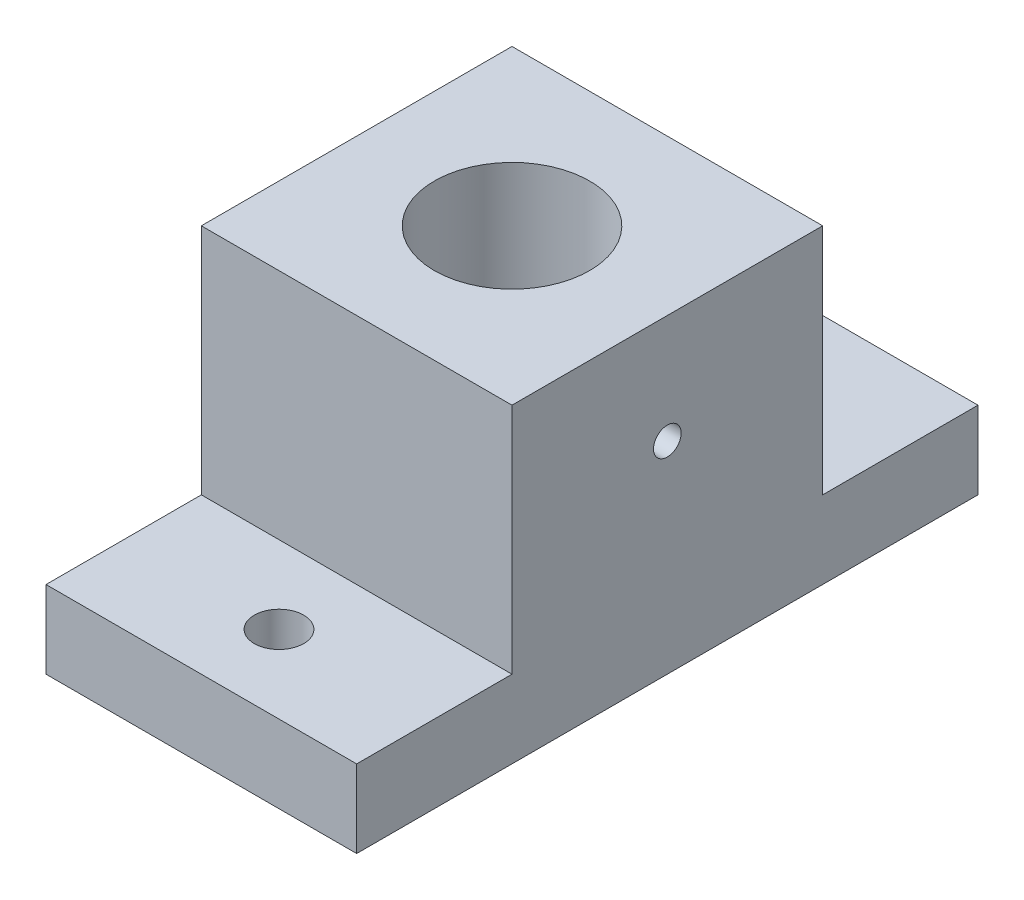
ISO-10303-21;
HEADER;
FILE_DESCRIPTION(('STEP AP214'),'2;1');
FILE_NAME('part.step','',(''),(''),'','','');
FILE_SCHEMA(('AUTOMOTIVE_DESIGN { 1 0 10303 214 1 1 1 1 }'));
ENDSEC;
DATA;
#1=APPLICATION_CONTEXT('core data for automotive mechanical design processes');
#2=APPLICATION_PROTOCOL_DEFINITION('international standard','automotive_design',2000,#1);
#3=PRODUCT_CONTEXT('',#1,'mechanical');
#4=PRODUCT('Part','Part','',(#3));
#5=PRODUCT_RELATED_PRODUCT_CATEGORY('part','',(#4));
#6=PRODUCT_DEFINITION_FORMATION('','',#4);
#7=PRODUCT_DEFINITION_CONTEXT('part definition',#1,'design');
#8=PRODUCT_DEFINITION('design','',#6,#7);
#9=PRODUCT_DEFINITION_SHAPE('','',#8);
#10=(LENGTH_UNIT() NAMED_UNIT(*) SI_UNIT(.MILLI.,.METRE.));
#11=(NAMED_UNIT(*) PLANE_ANGLE_UNIT() SI_UNIT($,.RADIAN.));
#12=(NAMED_UNIT(*) SI_UNIT($,.STERADIAN.) SOLID_ANGLE_UNIT());
#13=UNCERTAINTY_MEASURE_WITH_UNIT(LENGTH_MEASURE(1.E-05),#10,'distance_accuracy_value','');
#14=(GEOMETRIC_REPRESENTATION_CONTEXT(3) GLOBAL_UNCERTAINTY_ASSIGNED_CONTEXT((#13)) GLOBAL_UNIT_ASSIGNED_CONTEXT((#10,
#11,#12)) REPRESENTATION_CONTEXT('',''));
#15=CARTESIAN_POINT('',(0.,0.,0.));
#16=DIRECTION('',(0.,0.,1.));
#17=DIRECTION('',(1.,0.,0.));
#18=AXIS2_PLACEMENT_3D('',#15,#16,#17);
#19=CARTESIAN_POINT('',(0.,6.35,0.));
#20=DIRECTION('',(0.,1.,0.));
#21=DIRECTION('',(0.,0.,1.));
#22=AXIS2_PLACEMENT_3D('',#19,#20,#21);
#23=PLANE('',#22);
#24=CARTESIAN_POINT('',(0.,6.35,-19.05));
#25=DIRECTION('',(0.,1.,0.));
#26=DIRECTION('',(0.,0.,1.));
#27=AXIS2_PLACEMENT_3D('',#24,#25,#26);
#28=CIRCLE('',#27,2.01929999999999);
#29=CARTESIAN_POINT('',(0.,6.35,-17.0307));
#30=VERTEX_POINT('',#29);
#31=EDGE_CURVE('E193',#30,#30,#28,.T.);
#32=ORIENTED_EDGE('',*,*,#31,.F.);
#33=EDGE_LOOP('',(#32));
#34=FACE_BOUND('',#33,.T.);
#35=DIRECTION('',(-1.,0.,0.));
#36=VECTOR('',#35,1.);
#37=CARTESIAN_POINT('',(12.7,6.35,-12.7));
#38=LINE('',#37,#36);
#39=CARTESIAN_POINT('',(12.7,6.35,-12.7));
#40=VERTEX_POINT('',#39);
#41=CARTESIAN_POINT('',(-12.7,6.35,-12.7));
#42=VERTEX_POINT('',#41);
#43=EDGE_CURVE('E49',#40,#42,#38,.T.);
#44=ORIENTED_EDGE('',*,*,#43,.F.);
#45=DIRECTION('',(0.,0.,-1.));
#46=VECTOR('',#45,1.);
#47=CARTESIAN_POINT('',(12.7,6.35,25.4));
#48=LINE('',#47,#46);
#49=CARTESIAN_POINT('',(12.7,6.35,-25.4));
#50=VERTEX_POINT('',#49);
#51=EDGE_CURVE('E134',#40,#50,#48,.T.);
#52=ORIENTED_EDGE('',*,*,#51,.T.);
#53=DIRECTION('',(-1.,0.,0.));
#54=VECTOR('',#53,1.);
#55=CARTESIAN_POINT('',(12.7,6.35,-25.4));
#56=LINE('',#55,#54);
#57=CARTESIAN_POINT('',(-12.7,6.35,-25.4));
#58=VERTEX_POINT('',#57);
#59=EDGE_CURVE('E137',#50,#58,#56,.T.);
#60=ORIENTED_EDGE('',*,*,#59,.T.);
#61=DIRECTION('',(0.,0.,1.));
#62=VECTOR('',#61,1.);
#63=CARTESIAN_POINT('',(-12.7,6.35,25.4));
#64=LINE('',#63,#62);
#65=EDGE_CURVE('E130',#58,#42,#64,.T.);
#66=ORIENTED_EDGE('',*,*,#65,.T.);
#67=EDGE_LOOP('',(#44,#52,#60,#66));
#68=FACE_BOUND('',#67,.T.);
#69=ADVANCED_FACE('F34',(#34,#68),#23,.T.);
#70=CARTESIAN_POINT('',(-12.7,6.35,25.4));
#71=DIRECTION('',(1.,0.,0.));
#72=DIRECTION('',(0.,0.,-1.));
#73=AXIS2_PLACEMENT_3D('',#70,#71,#72);
#74=PLANE('',#73);
#75=DIRECTION('',(0.,0.,1.));
#76=VECTOR('',#75,1.);
#77=CARTESIAN_POINT('',(-12.7,0.,25.4));
#78=LINE('',#77,#76);
#79=CARTESIAN_POINT('',(-12.7,0.,-25.4));
#80=VERTEX_POINT('',#79);
#81=CARTESIAN_POINT('',(-12.7,0.,25.4));
#82=VERTEX_POINT('',#81);
#83=EDGE_CURVE('E122',#80,#82,#78,.T.);
#84=ORIENTED_EDGE('',*,*,#83,.T.);
#85=DIRECTION('',(0.,-1.,0.));
#86=VECTOR('',#85,1.);
#87=CARTESIAN_POINT('',(-12.7,6.35,25.4));
#88=LINE('',#87,#86);
#89=CARTESIAN_POINT('',(-12.7,6.35,25.4));
#90=VERTEX_POINT('',#89);
#91=EDGE_CURVE('E11',#90,#82,#88,.T.);
#92=ORIENTED_EDGE('',*,*,#91,.F.);
#93=CARTESIAN_POINT('',(-12.7,6.35,12.7));
#94=VERTEX_POINT('',#93);
#95=EDGE_CURVE('E121',#94,#90,#64,.T.);
#96=ORIENTED_EDGE('',*,*,#95,.F.);
#97=DIRECTION('',(0.,-1.,0.));
#98=VECTOR('',#97,1.);
#99=CARTESIAN_POINT('',(-12.7,25.4,12.7));
#100=LINE('',#99,#98);
#101=CARTESIAN_POINT('',(-12.7,25.4,12.7));
#102=VERTEX_POINT('',#101);
#103=EDGE_CURVE('E103',#102,#94,#100,.T.);
#104=ORIENTED_EDGE('',*,*,#103,.F.);
#105=DIRECTION('',(0.,0.,1.));
#106=VECTOR('',#105,1.);
#107=CARTESIAN_POINT('',(-12.7,25.4,12.7));
#108=LINE('',#107,#106);
#109=CARTESIAN_POINT('',(-12.7,25.4,-12.7));
#110=VERTEX_POINT('',#109);
#111=EDGE_CURVE('E109',#110,#102,#108,.T.);
#112=ORIENTED_EDGE('',*,*,#111,.F.);
#113=DIRECTION('',(0.,-1.,0.));
#114=VECTOR('',#113,1.);
#115=CARTESIAN_POINT('',(-12.7,25.4,-12.7));
#116=LINE('',#115,#114);
#117=EDGE_CURVE('E167',#110,#42,#116,.T.);
#118=ORIENTED_EDGE('',*,*,#117,.T.);
#119=ORIENTED_EDGE('',*,*,#65,.F.);
#120=DIRECTION('',(0.,-1.,0.));
#121=VECTOR('',#120,1.);
#122=CARTESIAN_POINT('',(-12.7,6.35,-25.4));
#123=LINE('',#122,#121);
#124=EDGE_CURVE('E138',#58,#80,#123,.T.);
#125=ORIENTED_EDGE('',*,*,#124,.T.);
#126=EDGE_LOOP('',(#84,#92,#96,#104,#112,#118,#119,#125));
#127=FACE_BOUND('',#126,.T.);
#128=ADVANCED_FACE('F36',(#127),#74,.F.);
#129=CARTESIAN_POINT('',(12.7,6.35,25.4));
#130=DIRECTION('',(0.,0.,-1.));
#131=DIRECTION('',(-1.,0.,0.));
#132=AXIS2_PLACEMENT_3D('',#129,#130,#131);
#133=PLANE('',#132);
#134=DIRECTION('',(1.,0.,0.));
#135=VECTOR('',#134,1.);
#136=CARTESIAN_POINT('',(12.7,0.,25.4));
#137=LINE('',#136,#135);
#138=CARTESIAN_POINT('',(12.7,0.,25.4));
#139=VERTEX_POINT('',#138);
#140=EDGE_CURVE('E124',#82,#139,#137,.T.);
#141=ORIENTED_EDGE('',*,*,#140,.T.);
#142=DIRECTION('',(0.,-1.,0.));
#143=VECTOR('',#142,1.);
#144=CARTESIAN_POINT('',(12.7,6.35,25.4));
#145=LINE('',#144,#143);
#146=CARTESIAN_POINT('',(12.7,6.35,25.4));
#147=VERTEX_POINT('',#146);
#148=EDGE_CURVE('E42',#147,#139,#145,.T.);
#149=ORIENTED_EDGE('',*,*,#148,.F.);
#150=DIRECTION('',(1.,0.,0.));
#151=VECTOR('',#150,1.);
#152=CARTESIAN_POINT('',(12.7,6.35,25.4));
#153=LINE('',#152,#151);
#154=EDGE_CURVE('E132',#90,#147,#153,.T.);
#155=ORIENTED_EDGE('',*,*,#154,.F.);
#156=ORIENTED_EDGE('',*,*,#91,.T.);
#157=EDGE_LOOP('',(#141,#149,#155,#156));
#158=FACE_BOUND('',#157,.T.);
#159=ADVANCED_FACE('F226',(#158),#133,.F.);
#160=CARTESIAN_POINT('',(12.7,6.35,25.4));
#161=DIRECTION('',(-1.,0.,0.));
#162=DIRECTION('',(0.,0.,1.));
#163=AXIS2_PLACEMENT_3D('',#160,#161,#162);
#164=PLANE('',#163);
#165=CARTESIAN_POINT('',(12.7,16.51,0.));
#166=DIRECTION('',(1.,0.,0.));
#167=DIRECTION('',(0.,0.,-1.));
#168=AXIS2_PLACEMENT_3D('',#165,#166,#167);
#169=CIRCLE('',#168,1.1303);
#170=CARTESIAN_POINT('',(12.7,16.51,-1.1303));
#171=VERTEX_POINT('',#170);
#172=EDGE_CURVE('E204',#171,#171,#169,.T.);
#173=ORIENTED_EDGE('',*,*,#172,.F.);
#174=EDGE_LOOP('',(#173));
#175=FACE_BOUND('',#174,.T.);
#176=DIRECTION('',(0.,0.,-1.));
#177=VECTOR('',#176,1.);
#178=CARTESIAN_POINT('',(12.7,0.,25.4));
#179=LINE('',#178,#177);
#180=CARTESIAN_POINT('',(12.7,0.,-25.4));
#181=VERTEX_POINT('',#180);
#182=EDGE_CURVE('E141',#139,#181,#179,.T.);
#183=ORIENTED_EDGE('',*,*,#182,.T.);
#184=DIRECTION('',(0.,-1.,0.));
#185=VECTOR('',#184,1.);
#186=CARTESIAN_POINT('',(12.7,6.35,-25.4));
#187=LINE('',#186,#185);
#188=EDGE_CURVE('E147',#50,#181,#187,.T.);
#189=ORIENTED_EDGE('',*,*,#188,.F.);
#190=ORIENTED_EDGE('',*,*,#51,.F.);
#191=DIRECTION('',(0.,-1.,0.));
#192=VECTOR('',#191,1.);
#193=CARTESIAN_POINT('',(12.7,25.4,-12.7));
#194=LINE('',#193,#192);
#195=CARTESIAN_POINT('',(12.7,25.4,-12.7));
#196=VERTEX_POINT('',#195);
#197=EDGE_CURVE('E126',#196,#40,#194,.T.);
#198=ORIENTED_EDGE('',*,*,#197,.F.);
#199=DIRECTION('',(0.,0.,-1.));
#200=VECTOR('',#199,1.);
#201=CARTESIAN_POINT('',(12.7,25.4,12.7));
#202=LINE('',#201,#200);
#203=CARTESIAN_POINT('',(12.7,25.4,12.7));
#204=VERTEX_POINT('',#203);
#205=EDGE_CURVE('E108',#204,#196,#202,.T.);
#206=ORIENTED_EDGE('',*,*,#205,.F.);
#207=DIRECTION('',(0.,-1.,0.));
#208=VECTOR('',#207,1.);
#209=CARTESIAN_POINT('',(12.7,25.4,12.7));
#210=LINE('',#209,#208);
#211=CARTESIAN_POINT('',(12.7,6.35,12.7));
#212=VERTEX_POINT('',#211);
#213=EDGE_CURVE('E105',#204,#212,#210,.T.);
#214=ORIENTED_EDGE('',*,*,#213,.T.);
#215=EDGE_CURVE('E135',#147,#212,#48,.T.);
#216=ORIENTED_EDGE('',*,*,#215,.F.);
#217=ORIENTED_EDGE('',*,*,#148,.T.);
#218=EDGE_LOOP('',(#183,#189,#190,#198,#206,#214,#216,#217));
#219=FACE_BOUND('',#218,.T.);
#220=ADVANCED_FACE('F154',(#175,#219),#164,.F.);
#221=CARTESIAN_POINT('',(12.7,6.35,-25.4));
#222=DIRECTION('',(0.,0.,1.));
#223=DIRECTION('',(1.,0.,0.));
#224=AXIS2_PLACEMENT_3D('',#221,#222,#223);
#225=PLANE('',#224);
#226=DIRECTION('',(-1.,0.,0.));
#227=VECTOR('',#226,1.);
#228=CARTESIAN_POINT('',(12.7,0.,-25.4));
#229=LINE('',#228,#227);
#230=EDGE_CURVE('E143',#181,#80,#229,.T.);
#231=ORIENTED_EDGE('',*,*,#230,.T.);
#232=ORIENTED_EDGE('',*,*,#124,.F.);
#233=ORIENTED_EDGE('',*,*,#59,.F.);
#234=ORIENTED_EDGE('',*,*,#188,.T.);
#235=EDGE_LOOP('',(#231,#232,#233,#234));
#236=FACE_BOUND('',#235,.T.);
#237=ADVANCED_FACE('F164',(#236),#225,.F.);
#238=CARTESIAN_POINT('',(0.,6.35,19.05));
#239=DIRECTION('',(0.,1.,0.));
#240=DIRECTION('',(0.,0.,1.));
#241=AXIS2_PLACEMENT_3D('',#238,#239,#240);
#242=CIRCLE('',#241,2.01929999999999);
#243=CARTESIAN_POINT('',(0.,6.35,21.0693));
#244=VERTEX_POINT('',#243);
#245=EDGE_CURVE('E187',#244,#244,#242,.T.);
#246=ORIENTED_EDGE('',*,*,#245,.F.);
#247=EDGE_LOOP('',(#246));
#248=FACE_BOUND('',#247,.T.);
#249=DIRECTION('',(1.,0.,0.));
#250=VECTOR('',#249,1.);
#251=CARTESIAN_POINT('',(12.7,6.35,12.7));
#252=LINE('',#251,#250);
#253=EDGE_CURVE('E57',#94,#212,#252,.T.);
#254=ORIENTED_EDGE('',*,*,#253,.F.);
#255=ORIENTED_EDGE('',*,*,#95,.T.);
#256=ORIENTED_EDGE('',*,*,#154,.T.);
#257=ORIENTED_EDGE('',*,*,#215,.T.);
#258=EDGE_LOOP('',(#254,#255,#256,#257));
#259=FACE_BOUND('',#258,.T.);
#260=ADVANCED_FACE('F222',(#248,#259),#23,.T.);
#261=CARTESIAN_POINT('',(0.,0.,0.));
#262=DIRECTION('',(0.,1.,0.));
#263=DIRECTION('',(0.,0.,1.));
#264=AXIS2_PLACEMENT_3D('',#261,#262,#263);
#265=PLANE('',#264);
#266=CARTESIAN_POINT('',(0.,0.,-19.05));
#267=DIRECTION('',(0.,1.,0.));
#268=DIRECTION('',(0.,0.,1.));
#269=AXIS2_PLACEMENT_3D('',#266,#267,#268);
#270=CIRCLE('',#269,2.0193);
#271=CARTESIAN_POINT('',(0.,0.,-17.0307));
#272=VERTEX_POINT('',#271);
#273=EDGE_CURVE('E190',#272,#272,#270,.T.);
#274=ORIENTED_EDGE('',*,*,#273,.T.);
#275=EDGE_LOOP('',(#274));
#276=FACE_BOUND('',#275,.T.);
#277=CARTESIAN_POINT('',(0.,0.,19.05));
#278=DIRECTION('',(0.,1.,0.));
#279=DIRECTION('',(0.,0.,1.));
#280=AXIS2_PLACEMENT_3D('',#277,#278,#279);
#281=CIRCLE('',#280,2.0193);
#282=CARTESIAN_POINT('',(0.,0.,21.0693));
#283=VERTEX_POINT('',#282);
#284=EDGE_CURVE('E182',#283,#283,#281,.T.);
#285=ORIENTED_EDGE('',*,*,#284,.T.);
#286=EDGE_LOOP('',(#285));
#287=FACE_BOUND('',#286,.T.);
#288=CARTESIAN_POINT('',(0.,0.,0.));
#289=DIRECTION('',(0.,1.,0.));
#290=DIRECTION('',(0.,0.,1.));
#291=AXIS2_PLACEMENT_3D('',#288,#289,#290);
#292=CIRCLE('',#291,6.35);
#293=CARTESIAN_POINT('',(0.,0.,6.35));
#294=VERTEX_POINT('',#293);
#295=EDGE_CURVE('E173',#294,#294,#292,.T.);
#296=ORIENTED_EDGE('',*,*,#295,.T.);
#297=EDGE_LOOP('',(#296));
#298=FACE_BOUND('',#297,.T.);
#299=ORIENTED_EDGE('',*,*,#83,.F.);
#300=ORIENTED_EDGE('',*,*,#230,.F.);
#301=ORIENTED_EDGE('',*,*,#182,.F.);
#302=ORIENTED_EDGE('',*,*,#140,.F.);
#303=EDGE_LOOP('',(#299,#300,#301,#302));
#304=FACE_BOUND('',#303,.T.);
#305=ADVANCED_FACE('F161',(#276,#287,#298,#304),#265,.F.);
#306=CARTESIAN_POINT('',(12.7,25.4,12.7));
#307=DIRECTION('',(0.,0.,-1.));
#308=DIRECTION('',(-1.,0.,0.));
#309=AXIS2_PLACEMENT_3D('',#306,#307,#308);
#310=PLANE('',#309);
#311=ORIENTED_EDGE('',*,*,#253,.T.);
#312=ORIENTED_EDGE('',*,*,#213,.F.);
#313=DIRECTION('',(1.,0.,0.));
#314=VECTOR('',#313,1.);
#315=CARTESIAN_POINT('',(12.7,25.4,12.7));
#316=LINE('',#315,#314);
#317=EDGE_CURVE('E99',#102,#204,#316,.T.);
#318=ORIENTED_EDGE('',*,*,#317,.F.);
#319=ORIENTED_EDGE('',*,*,#103,.T.);
#320=EDGE_LOOP('',(#311,#312,#318,#319));
#321=FACE_BOUND('',#320,.T.);
#322=ADVANCED_FACE('F101',(#321),#310,.F.);
#323=CARTESIAN_POINT('',(12.7,25.4,-12.7));
#324=DIRECTION('',(0.,0.,1.));
#325=DIRECTION('',(1.,0.,0.));
#326=AXIS2_PLACEMENT_3D('',#323,#324,#325);
#327=PLANE('',#326);
#328=ORIENTED_EDGE('',*,*,#43,.T.);
#329=ORIENTED_EDGE('',*,*,#117,.F.);
#330=DIRECTION('',(-1.,0.,0.));
#331=VECTOR('',#330,1.);
#332=CARTESIAN_POINT('',(12.7,25.4,-12.7));
#333=LINE('',#332,#331);
#334=EDGE_CURVE('E114',#196,#110,#333,.T.);
#335=ORIENTED_EDGE('',*,*,#334,.F.);
#336=ORIENTED_EDGE('',*,*,#197,.T.);
#337=EDGE_LOOP('',(#328,#329,#335,#336));
#338=FACE_BOUND('',#337,.T.);
#339=ADVANCED_FACE('F170',(#338),#327,.F.);
#340=CARTESIAN_POINT('',(0.,25.4,0.));
#341=DIRECTION('',(0.,1.,0.));
#342=DIRECTION('',(0.,0.,1.));
#343=AXIS2_PLACEMENT_3D('',#340,#341,#342);
#344=PLANE('',#343);
#345=CARTESIAN_POINT('',(0.,25.4,0.));
#346=DIRECTION('',(0.,1.,0.));
#347=DIRECTION('',(0.,0.,1.));
#348=AXIS2_PLACEMENT_3D('',#345,#346,#347);
#349=CIRCLE('',#348,6.35);
#350=CARTESIAN_POINT('',(0.,25.4,6.35));
#351=VERTEX_POINT('',#350);
#352=EDGE_CURVE('E179',#351,#351,#349,.T.);
#353=ORIENTED_EDGE('',*,*,#352,.F.);
#354=EDGE_LOOP('',(#353));
#355=FACE_BOUND('',#354,.T.);
#356=ORIENTED_EDGE('',*,*,#111,.T.);
#357=ORIENTED_EDGE('',*,*,#317,.T.);
#358=ORIENTED_EDGE('',*,*,#205,.T.);
#359=ORIENTED_EDGE('',*,*,#334,.T.);
#360=EDGE_LOOP('',(#356,#357,#358,#359));
#361=FACE_BOUND('',#360,.T.);
#362=ADVANCED_FACE('F112',(#355,#361),#344,.T.);
#363=CARTESIAN_POINT('',(0.,0.,0.));
#364=DIRECTION('',(0.,1.,0.));
#365=DIRECTION('',(0.,0.,1.));
#366=AXIS2_PLACEMENT_3D('',#363,#364,#365);
#367=CYLINDRICAL_SURFACE('',#366,6.35);
#368=CARTESIAN_POINT('',(6.2485935945619,16.51,-1.1303));
#369=CARTESIAN_POINT('',(6.24859477928636,16.5729474816605,-1.13029752860319));
#370=CARTESIAN_POINT('',(6.24955510147455,16.6359277266989,-1.12502376655344));
#371=CARTESIAN_POINT('',(6.253288450742,16.7601164574491,-1.10407989662448));
#372=CARTESIAN_POINT('',(6.25606307842284,16.8213233288314,-1.08840060868597));
#373=CARTESIAN_POINT('',(6.26310106017997,16.9401502639791,-1.04713896619609));
#374=CARTESIAN_POINT('',(6.26736309431536,16.9977734547007,-1.02156538976728));
#375=CARTESIAN_POINT('',(6.27689410394911,17.1079065233362,-0.961263736790335));
#376=CARTESIAN_POINT('',(6.28216298460781,17.1604168821493,-0.926536522350171));
#377=CARTESIAN_POINT('',(6.29318010060458,17.2594282501686,-0.848497662550802));
#378=CARTESIAN_POINT('',(6.29893262327816,17.3058635240626,-0.805103209146808));
#379=CARTESIAN_POINT('',(6.31023089151142,17.3908346900162,-0.71114065611469));
#380=CARTESIAN_POINT('',(6.31577662411108,17.4293700876505,-0.660572107820277));
#381=CARTESIAN_POINT('',(6.3260821366722,17.4976971356988,-0.553267727306868));
#382=CARTESIAN_POINT('',(6.33083628120179,17.5274271753841,-0.49649207639362));
#383=CARTESIAN_POINT('',(6.33897509325521,17.5769030822544,-0.378653475620937));
#384=CARTESIAN_POINT('',(6.34235986225469,17.5966496892748,-0.317590843835823));
#385=CARTESIAN_POINT('',(6.34734827608291,17.6253959469096,-0.19359192949642));
#386=CARTESIAN_POINT('',(6.34897024782024,17.6345062530837,-0.130682049247925));
#387=CARTESIAN_POINT('',(6.35031338922828,17.6420657608453,-0.00420718696587588));
#388=CARTESIAN_POINT('',(6.35003470542113,17.6405157842373,0.0593577441923841));
#389=CARTESIAN_POINT('',(6.34762234490442,17.6268842622789,0.184580543784093));
#390=CARTESIAN_POINT('',(6.34550965008509,17.6149218357653,0.2462518415954));
#391=CARTESIAN_POINT('',(6.33969011077832,17.5809929907874,0.366697607884814));
#392=CARTESIAN_POINT('',(6.33598321254887,17.5590262350669,0.42547197863051));
#393=CARTESIAN_POINT('',(6.32735638635074,17.505596503427,0.538805120450374));
#394=CARTESIAN_POINT('',(6.32243031191731,17.4740852229098,0.593340631871786));
#395=CARTESIAN_POINT('',(6.31191110570192,17.4024964249582,0.696394590932215));
#396=CARTESIAN_POINT('',(6.30631791258354,17.3624181195831,0.744912484459766));
#397=CARTESIAN_POINT('',(6.29499388871477,17.2741745040808,0.835258832297391));
#398=CARTESIAN_POINT('',(6.28926222422367,17.2259050230152,0.876985499299351));
#399=CARTESIAN_POINT('',(6.27838159660169,17.1229981203382,0.951765111250202));
#400=CARTESIAN_POINT('',(6.27323264041835,17.0683606228177,0.984817952788779));
#401=CARTESIAN_POINT('',(6.26409955120621,16.9541416646748,1.04133641697596));
#402=CARTESIAN_POINT('',(6.26011707226906,16.8945533357824,1.06478844399584));
#403=CARTESIAN_POINT('',(6.25379407198502,16.7721958260408,1.10132048259893));
#404=CARTESIAN_POINT('',(6.25145338427448,16.7094269681678,1.11440154509545));
#405=CARTESIAN_POINT('',(6.24871157429963,16.5834046847655,1.12967421074342));
#406=CARTESIAN_POINT('',(6.24828450262101,16.5201694640597,1.1320115149774));
#407=CARTESIAN_POINT('',(6.24934899119854,16.3942119074406,1.12611980656729));
#408=CARTESIAN_POINT('',(6.25084046640858,16.3314895489171,1.11789126229031));
#409=CARTESIAN_POINT('',(6.25554991782972,16.2088095478001,1.09122611970099));
#410=CARTESIAN_POINT('',(6.25875514695102,16.1488349974947,1.0728648576672));
#411=CARTESIAN_POINT('',(6.26652011136834,16.032813851591,1.02653498701514));
#412=CARTESIAN_POINT('',(6.27107993778172,15.9767675205389,0.998565732092789));
#413=CARTESIAN_POINT('',(6.28109997867828,15.8695487872683,0.933474479097979));
#414=CARTESIAN_POINT('',(6.28656911125703,15.8184334904594,0.896259814835743));
#415=CARTESIAN_POINT('',(6.29776598333193,15.7231206593862,0.813860130740533));
#416=CARTESIAN_POINT('',(6.30349374365968,15.6789236836549,0.768674468015049));
#417=CARTESIAN_POINT('',(6.3146452745759,15.598163533603,0.67096713520899));
#418=CARTESIAN_POINT('',(6.3200645909399,15.5616979657711,0.618364201269159));
#419=CARTESIAN_POINT('',(6.32991535892806,15.4981221724374,0.507694087392303));
#420=CARTESIAN_POINT('',(6.33434684584306,15.4710116127032,0.449627102767365));
#421=CARTESIAN_POINT('',(6.34170339516869,15.4270642471255,0.32995637799644));
#422=CARTESIAN_POINT('',(6.34463569095833,15.4101780360788,0.268371245166505));
#423=CARTESIAN_POINT('',(6.34869419748068,15.3870003300381,0.143182328625892));
#424=CARTESIAN_POINT('',(6.34982057868977,15.3807078350061,0.0795787360337586));
#425=CARTESIAN_POINT('',(6.35013741439244,15.3789281674832,-0.0469027850895872));
#426=CARTESIAN_POINT('',(6.3493543717336,15.3832930711384,-0.109778614269506));
#427=CARTESIAN_POINT('',(6.34599495704242,15.4023822121945,-0.23388607767908));
#428=CARTESIAN_POINT('',(6.34341859867981,15.4171063706309,-0.295117724437984));
#429=CARTESIAN_POINT('',(6.33676147675179,15.4564362890186,-0.414130647219051));
#430=CARTESIAN_POINT('',(6.33268288590209,15.4810277821713,-0.471916767035408));
#431=CARTESIAN_POINT('',(6.32346454814741,15.5393772011528,-0.582565157591167));
#432=CARTESIAN_POINT('',(6.31832473973479,15.5731356583302,-0.63542714267225));
#433=CARTESIAN_POINT('',(6.30746821917931,15.6493771121249,-0.735467702991134));
#434=CARTESIAN_POINT('',(6.3017448838471,15.6919676821887,-0.782563586469948));
#435=CARTESIAN_POINT('',(6.29041003362776,15.7844398122169,-0.868991600851846));
#436=CARTESIAN_POINT('',(6.2847985452783,15.8343230796437,-0.908321908493053));
#437=CARTESIAN_POINT('',(6.27427269331679,15.9404528951587,-0.978402705974919));
#438=CARTESIAN_POINT('',(6.26936442851344,15.9967483036151,-1.00908013748217));
#439=CARTESIAN_POINT('',(6.26087346378714,16.1137606354763,-1.06049430719683));
#440=CARTESIAN_POINT('',(6.25728947888211,16.1744732039523,-1.08124068756143));
#441=CARTESIAN_POINT('',(6.2526226773509,16.2811606817546,-1.10785061597257));
#442=CARTESIAN_POINT('',(6.25112047177959,16.3265004659474,-1.116255146414));
#443=CARTESIAN_POINT('',(6.24910550811149,16.4178876622077,-1.1274806794138));
#444=CARTESIAN_POINT('',(6.24859272758101,16.4639350582073,-1.13030180856719));
#445=CARTESIAN_POINT('',(6.2485935945619,16.51,-1.1303));
#446=B_SPLINE_CURVE_WITH_KNOTS('',3,(#368,#369,#370,#371,#372,#373,#374,#375,#376,#377,#378,
#379,#380,#381,#382,#383,#384,#385,#386,#387,#388,#389,#390,#391,#392,#393,#394,#395,#396,#397,
#398,#399,#400,#401,#402,#403,#404,#405,#406,#407,#408,#409,#410,#411,#412,#413,#414,#415,#416,
#417,#418,#419,#420,#421,#422,#423,#424,#425,#426,#427,#428,#429,#430,#431,#432,#433,#434,#435,
#436,#437,#438,#439,#440,#441,#442,#443,#444,#445),.UNSPECIFIED.,.T.,.F.,(4,2,2,2,2,2,2,2,2,2,2,
2,2,2,2,2,2,2,2,2,2,2,2,2,2,2,2,2,2,2,2,2,2,2,2,2,2,2,4),(0.,0.188673929647672,0.37751453462614,
0.566187984707768,0.754843671490913,0.945396353842158,1.13596095857324,1.32782903745418,
1.5196828956175,1.70952248173694,1.89934743322769,2.08702890424999,2.27471670267543,
2.46337072228333,2.65204210056539,2.84332262546284,3.03460543072443,3.22615818062715,
3.41769151757454,3.6066195664056,3.79553924064847,3.98307286921064,4.17061911513114,
4.3601268464934,4.54964986939679,4.74143924348984,4.93322176468822,5.1240700176069,
5.31490025359552,5.50309687534891,5.6912920625706,5.8792161205219,6.06715107352077,
6.25752581883364,6.44794520878684,6.63992726090082,6.83172253573714,6.96979717232729,
7.10786867825191),.UNSPECIFIED.);
#447=CARTESIAN_POINT('',(6.2485935945619,16.51,-1.1303));
#448=VERTEX_POINT('',#447);
#449=EDGE_CURVE('E196',#448,#448,#446,.T.);
#450=ORIENTED_EDGE('',*,*,#449,.T.);
#451=EDGE_LOOP('',(#450));
#452=FACE_BOUND('',#451,.T.);
#453=ORIENTED_EDGE('',*,*,#295,.F.);
#454=EDGE_LOOP('',(#453));
#455=FACE_BOUND('',#454,.T.);
#456=ORIENTED_EDGE('',*,*,#352,.T.);
#457=EDGE_LOOP('',(#456));
#458=FACE_BOUND('',#457,.T.);
#459=ADVANCED_FACE('F241',(#452,#455,#458),#367,.F.);
#460=CARTESIAN_POINT('',(0.,6.35,19.05));
#461=DIRECTION('',(0.,1.,0.));
#462=DIRECTION('',(0.,0.,1.));
#463=AXIS2_PLACEMENT_3D('',#460,#461,#462);
#464=CYLINDRICAL_SURFACE('',#463,2.01929999999999);
#465=ORIENTED_EDGE('',*,*,#284,.F.);
#466=EDGE_LOOP('',(#465));
#467=FACE_BOUND('',#466,.T.);
#468=ORIENTED_EDGE('',*,*,#245,.T.);
#469=EDGE_LOOP('',(#468));
#470=FACE_BOUND('',#469,.T.);
#471=ADVANCED_FACE('F215',(#467,#470),#464,.F.);
#472=CARTESIAN_POINT('',(0.,6.35,-19.05));
#473=DIRECTION('',(0.,1.,0.));
#474=DIRECTION('',(0.,0.,1.));
#475=AXIS2_PLACEMENT_3D('',#472,#473,#474);
#476=CYLINDRICAL_SURFACE('',#475,2.01929999999999);
#477=ORIENTED_EDGE('',*,*,#273,.F.);
#478=EDGE_LOOP('',(#477));
#479=FACE_BOUND('',#478,.T.);
#480=ORIENTED_EDGE('',*,*,#31,.T.);
#481=EDGE_LOOP('',(#480));
#482=FACE_BOUND('',#481,.T.);
#483=ADVANCED_FACE('F210',(#479,#482),#476,.F.);
#484=CARTESIAN_POINT('',(12.7,16.51,0.));
#485=DIRECTION('',(1.,0.,0.));
#486=DIRECTION('',(0.,0.,-1.));
#487=AXIS2_PLACEMENT_3D('',#484,#485,#486);
#488=CYLINDRICAL_SURFACE('',#487,1.1303);
#489=ORIENTED_EDGE('',*,*,#449,.F.);
#490=EDGE_LOOP('',(#489));
#491=FACE_BOUND('',#490,.T.);
#492=ORIENTED_EDGE('',*,*,#172,.T.);
#493=EDGE_LOOP('',(#492));
#494=FACE_BOUND('',#493,.T.);
#495=ADVANCED_FACE('F207',(#491,#494),#488,.F.);
#496=CLOSED_SHELL('',(#69,#128,#159,#220,#237,#260,#305,#322,#339,#362,#459,#471,#483,#495));
#497=MANIFOLD_SOLID_BREP('B2',#496);
#498=ADVANCED_BREP_SHAPE_REPRESENTATION('',(#18,#497),#14);
#499=SHAPE_DEFINITION_REPRESENTATION(#9,#498);
ENDSEC;
END-ISO-10303-21;
